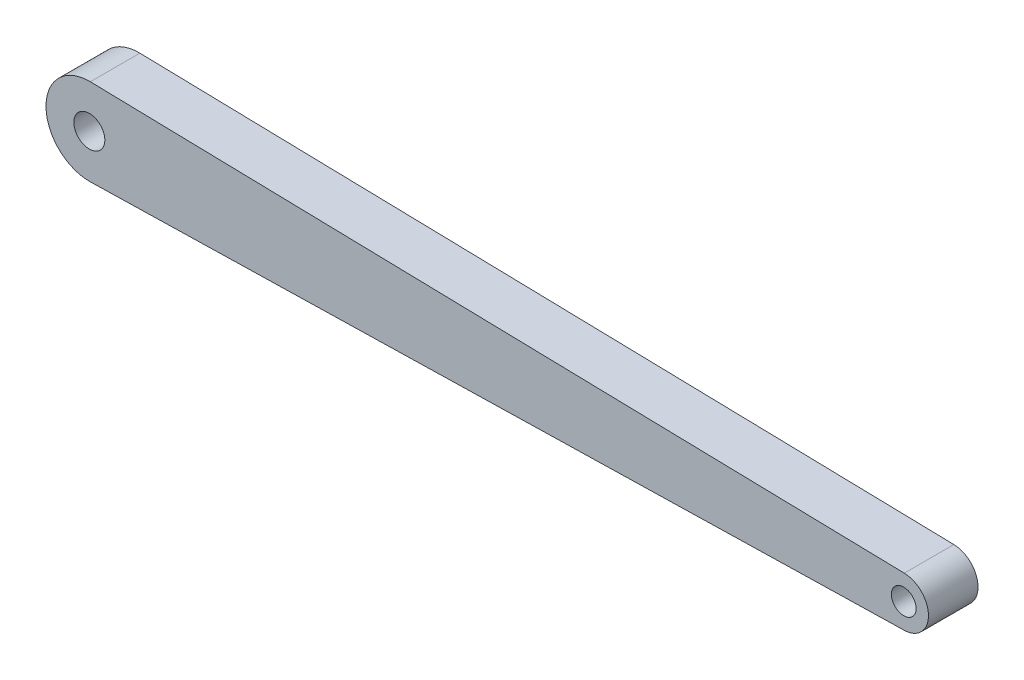
ISO-10303-21;
HEADER;
FILE_DESCRIPTION(('STEP AP214'),'2;1');
FILE_NAME('part.step','',(''),(''),'','','');
FILE_SCHEMA(('AUTOMOTIVE_DESIGN { 1 0 10303 214 1 1 1 1 }'));
ENDSEC;
DATA;
#1=APPLICATION_CONTEXT('core data for automotive mechanical design processes');
#2=APPLICATION_PROTOCOL_DEFINITION('international standard','automotive_design',2000,#1);
#3=PRODUCT_CONTEXT('',#1,'mechanical');
#4=PRODUCT('Part','Part','',(#3));
#5=PRODUCT_RELATED_PRODUCT_CATEGORY('part','',(#4));
#6=PRODUCT_DEFINITION_FORMATION('','',#4);
#7=PRODUCT_DEFINITION_CONTEXT('part definition',#1,'design');
#8=PRODUCT_DEFINITION('design','',#6,#7);
#9=PRODUCT_DEFINITION_SHAPE('','',#8);
#10=(LENGTH_UNIT() NAMED_UNIT(*) SI_UNIT(.MILLI.,.METRE.));
#11=(NAMED_UNIT(*) PLANE_ANGLE_UNIT() SI_UNIT($,.RADIAN.));
#12=(NAMED_UNIT(*) SI_UNIT($,.STERADIAN.) SOLID_ANGLE_UNIT());
#13=UNCERTAINTY_MEASURE_WITH_UNIT(LENGTH_MEASURE(1.E-05),#10,'distance_accuracy_value','');
#14=(GEOMETRIC_REPRESENTATION_CONTEXT(3) GLOBAL_UNCERTAINTY_ASSIGNED_CONTEXT((#13)) GLOBAL_UNIT_ASSIGNED_CONTEXT((#10,
#11,#12)) REPRESENTATION_CONTEXT('',''));
#15=CARTESIAN_POINT('',(0.,0.,0.));
#16=DIRECTION('',(0.,0.,1.));
#17=DIRECTION('',(1.,0.,0.));
#18=AXIS2_PLACEMENT_3D('',#15,#16,#17);
#19=CARTESIAN_POINT('',(-1315.,0.,40.));
#20=DIRECTION('',(0.,0.,-1.));
#21=DIRECTION('',(-1.,0.,0.));
#22=AXIS2_PLACEMENT_3D('',#19,#20,#21);
#23=PLANE('',#22);
#24=CARTESIAN_POINT('',(-1315.,0.,40.));
#25=DIRECTION('',(0.,0.,1.));
#26=DIRECTION('',(-1.,0.,0.));
#27=AXIS2_PLACEMENT_3D('',#24,#25,#26);
#28=CIRCLE('',#27,70.);
#29=CARTESIAN_POINT('',(-1313.40304182509,69.9817813762097,40.));
#30=VERTEX_POINT('',#29);
#31=CARTESIAN_POINT('',(-1313.40304182509,-69.9817813762097,40.));
#32=VERTEX_POINT('',#31);
#33=EDGE_CURVE('E85',#30,#32,#28,.T.);
#34=ORIENTED_EDGE('',*,*,#33,.T.);
#35=DIRECTION('',(0.999739733945852,0.0228136882129278,0.));
#36=VECTOR('',#35,1.);
#37=CARTESIAN_POINT('',(0.912547528517113,-39.9895893578341,40.));
#38=LINE('',#37,#36);
#39=CARTESIAN_POINT('',(0.912547528517113,-39.9895893578341,40.));
#40=VERTEX_POINT('',#39);
#41=EDGE_CURVE('E80',#32,#40,#38,.T.);
#42=ORIENTED_EDGE('',*,*,#41,.T.);
#43=CARTESIAN_POINT('',(0.,0.,40.));
#44=DIRECTION('',(0.,0.,1.));
#45=DIRECTION('',(1.,0.,0.));
#46=AXIS2_PLACEMENT_3D('',#43,#44,#45);
#47=CIRCLE('',#46,40.);
#48=CARTESIAN_POINT('',(0.912547528517098,39.9895893578341,40.));
#49=VERTEX_POINT('',#48);
#50=EDGE_CURVE('E83',#40,#49,#47,.T.);
#51=ORIENTED_EDGE('',*,*,#50,.T.);
#52=DIRECTION('',(-0.999739733945852,0.0228136882129278,0.));
#53=VECTOR('',#52,1.);
#54=CARTESIAN_POINT('',(-1313.40304182509,69.9817813762097,40.));
#55=LINE('',#54,#53);
#56=EDGE_CURVE('E50',#49,#30,#55,.T.);
#57=ORIENTED_EDGE('',*,*,#56,.T.);
#58=EDGE_LOOP('',(#34,#42,#51,#57));
#59=FACE_BOUND('',#58,.T.);
#60=CARTESIAN_POINT('',(0.,0.,40.));
#61=DIRECTION('',(0.,0.,1.));
#62=DIRECTION('',(1.,0.,0.));
#63=AXIS2_PLACEMENT_3D('',#60,#61,#62);
#64=CIRCLE('',#63,20.);
#65=CARTESIAN_POINT('',(20.,0.,40.));
#66=VERTEX_POINT('',#65);
#67=EDGE_CURVE('E100',#66,#66,#64,.T.);
#68=ORIENTED_EDGE('',*,*,#67,.F.);
#69=EDGE_LOOP('',(#68));
#70=FACE_BOUND('',#69,.T.);
#71=CARTESIAN_POINT('',(-1315.,0.,40.));
#72=DIRECTION('',(0.,0.,1.));
#73=DIRECTION('',(1.,0.,0.));
#74=AXIS2_PLACEMENT_3D('',#71,#72,#73);
#75=CIRCLE('',#74,25.);
#76=CARTESIAN_POINT('',(-1290.,0.,40.));
#77=VERTEX_POINT('',#76);
#78=EDGE_CURVE('E115',#77,#77,#75,.T.);
#79=ORIENTED_EDGE('',*,*,#78,.F.);
#80=EDGE_LOOP('',(#79));
#81=FACE_BOUND('',#80,.T.);
#82=ADVANCED_FACE('F33',(#59,#70,#81),#23,.F.);
#83=CARTESIAN_POINT('',(-1315.,0.,-40.));
#84=DIRECTION('',(0.,0.,-1.));
#85=DIRECTION('',(-1.,0.,0.));
#86=AXIS2_PLACEMENT_3D('',#83,#84,#85);
#87=PLANE('',#86);
#88=CARTESIAN_POINT('',(0.,0.,-40.));
#89=DIRECTION('',(0.,0.,1.));
#90=DIRECTION('',(1.,0.,0.));
#91=AXIS2_PLACEMENT_3D('',#88,#89,#90);
#92=CIRCLE('',#91,20.);
#93=CARTESIAN_POINT('',(20.,0.,-40.));
#94=VERTEX_POINT('',#93);
#95=EDGE_CURVE('E112',#94,#94,#92,.T.);
#96=ORIENTED_EDGE('',*,*,#95,.T.);
#97=EDGE_LOOP('',(#96));
#98=FACE_BOUND('',#97,.T.);
#99=CARTESIAN_POINT('',(-1315.,0.,-40.));
#100=DIRECTION('',(0.,0.,1.));
#101=DIRECTION('',(-1.,0.,0.));
#102=AXIS2_PLACEMENT_3D('',#99,#100,#101);
#103=CIRCLE('',#102,70.);
#104=CARTESIAN_POINT('',(-1313.40304182509,69.9817813762097,-40.));
#105=VERTEX_POINT('',#104);
#106=CARTESIAN_POINT('',(-1313.40304182509,-69.9817813762097,-40.));
#107=VERTEX_POINT('',#106);
#108=EDGE_CURVE('E97',#105,#107,#103,.T.);
#109=ORIENTED_EDGE('',*,*,#108,.F.);
#110=DIRECTION('',(-0.999739733945852,0.0228136882129278,0.));
#111=VECTOR('',#110,1.);
#112=CARTESIAN_POINT('',(-1313.40304182509,69.9817813762097,-40.));
#113=LINE('',#112,#111);
#114=CARTESIAN_POINT('',(0.912547528517098,39.9895893578341,-40.));
#115=VERTEX_POINT('',#114);
#116=EDGE_CURVE('E73',#115,#105,#113,.T.);
#117=ORIENTED_EDGE('',*,*,#116,.F.);
#118=CARTESIAN_POINT('',(0.,0.,-40.));
#119=DIRECTION('',(0.,0.,1.));
#120=DIRECTION('',(1.,0.,0.));
#121=AXIS2_PLACEMENT_3D('',#118,#119,#120);
#122=CIRCLE('',#121,40.);
#123=CARTESIAN_POINT('',(0.912547528517113,-39.9895893578341,-40.));
#124=VERTEX_POINT('',#123);
#125=EDGE_CURVE('E67',#124,#115,#122,.T.);
#126=ORIENTED_EDGE('',*,*,#125,.F.);
#127=DIRECTION('',(0.999739733945852,0.0228136882129278,0.));
#128=VECTOR('',#127,1.);
#129=CARTESIAN_POINT('',(0.912547528517113,-39.9895893578341,-40.));
#130=LINE('',#129,#128);
#131=EDGE_CURVE('E89',#107,#124,#130,.T.);
#132=ORIENTED_EDGE('',*,*,#131,.F.);
#133=EDGE_LOOP('',(#109,#117,#126,#132));
#134=FACE_BOUND('',#133,.T.);
#135=CARTESIAN_POINT('',(-1315.,0.,-40.));
#136=DIRECTION('',(0.,0.,1.));
#137=DIRECTION('',(1.,0.,0.));
#138=AXIS2_PLACEMENT_3D('',#135,#136,#137);
#139=CIRCLE('',#138,25.);
#140=CARTESIAN_POINT('',(-1290.,0.,-40.));
#141=VERTEX_POINT('',#140);
#142=EDGE_CURVE('E118',#141,#141,#139,.T.);
#143=ORIENTED_EDGE('',*,*,#142,.T.);
#144=EDGE_LOOP('',(#143));
#145=FACE_BOUND('',#144,.T.);
#146=ADVANCED_FACE('F108',(#98,#134,#145),#87,.T.);
#147=CARTESIAN_POINT('',(-1315.,0.,40.));
#148=DIRECTION('',(0.,0.,-1.));
#149=DIRECTION('',(-1.,0.,0.));
#150=AXIS2_PLACEMENT_3D('',#147,#148,#149);
#151=CYLINDRICAL_SURFACE('',#150,70.);
#152=ORIENTED_EDGE('',*,*,#108,.T.);
#153=DIRECTION('',(0.,0.,-1.));
#154=VECTOR('',#153,1.);
#155=CARTESIAN_POINT('',(-1313.40304182509,-69.9817813762097,40.));
#156=LINE('',#155,#154);
#157=EDGE_CURVE('E11',#32,#107,#156,.T.);
#158=ORIENTED_EDGE('',*,*,#157,.F.);
#159=ORIENTED_EDGE('',*,*,#33,.F.);
#160=DIRECTION('',(0.,0.,-1.));
#161=VECTOR('',#160,1.);
#162=CARTESIAN_POINT('',(-1313.40304182509,69.9817813762097,40.));
#163=LINE('',#162,#161);
#164=EDGE_CURVE('E93',#30,#105,#163,.T.);
#165=ORIENTED_EDGE('',*,*,#164,.T.);
#166=EDGE_LOOP('',(#152,#158,#159,#165));
#167=FACE_BOUND('',#166,.T.);
#168=ADVANCED_FACE('F35',(#167),#151,.T.);
#169=CARTESIAN_POINT('',(0.912547528517113,-39.9895893578341,40.));
#170=DIRECTION('',(-0.0228136882129278,0.999739733945852,0.));
#171=DIRECTION('',(-0.999739733945852,-0.0228136882129278,0.));
#172=AXIS2_PLACEMENT_3D('',#169,#170,#171);
#173=PLANE('',#172);
#174=ORIENTED_EDGE('',*,*,#131,.T.);
#175=DIRECTION('',(0.,0.,-1.));
#176=VECTOR('',#175,1.);
#177=CARTESIAN_POINT('',(0.912547528517113,-39.9895893578341,40.));
#178=LINE('',#177,#176);
#179=EDGE_CURVE('E42',#40,#124,#178,.T.);
#180=ORIENTED_EDGE('',*,*,#179,.F.);
#181=ORIENTED_EDGE('',*,*,#41,.F.);
#182=ORIENTED_EDGE('',*,*,#157,.T.);
#183=EDGE_LOOP('',(#174,#180,#181,#182));
#184=FACE_BOUND('',#183,.T.);
#185=ADVANCED_FACE('F88',(#184),#173,.F.);
#186=CARTESIAN_POINT('',(0.,0.,40.));
#187=DIRECTION('',(0.,0.,-1.));
#188=DIRECTION('',(-1.,0.,0.));
#189=AXIS2_PLACEMENT_3D('',#186,#187,#188);
#190=CYLINDRICAL_SURFACE('',#189,40.);
#191=ORIENTED_EDGE('',*,*,#125,.T.);
#192=DIRECTION('',(0.,0.,-1.));
#193=VECTOR('',#192,1.);
#194=CARTESIAN_POINT('',(0.912547528517098,39.9895893578341,40.));
#195=LINE('',#194,#193);
#196=EDGE_CURVE('E90',#49,#115,#195,.T.);
#197=ORIENTED_EDGE('',*,*,#196,.F.);
#198=ORIENTED_EDGE('',*,*,#50,.F.);
#199=ORIENTED_EDGE('',*,*,#179,.T.);
#200=EDGE_LOOP('',(#191,#197,#198,#199));
#201=FACE_BOUND('',#200,.T.);
#202=ADVANCED_FACE('F91',(#201),#190,.T.);
#203=CARTESIAN_POINT('',(-1313.40304182509,69.9817813762097,40.));
#204=DIRECTION('',(-0.0228136882129278,-0.999739733945852,0.));
#205=DIRECTION('',(0.999739733945852,-0.0228136882129278,0.));
#206=AXIS2_PLACEMENT_3D('',#203,#204,#205);
#207=PLANE('',#206);
#208=ORIENTED_EDGE('',*,*,#116,.T.);
#209=ORIENTED_EDGE('',*,*,#164,.F.);
#210=ORIENTED_EDGE('',*,*,#56,.F.);
#211=ORIENTED_EDGE('',*,*,#196,.T.);
#212=EDGE_LOOP('',(#208,#209,#210,#211));
#213=FACE_BOUND('',#212,.T.);
#214=ADVANCED_FACE('F105',(#213),#207,.F.);
#215=CARTESIAN_POINT('',(0.,0.,40.));
#216=DIRECTION('',(0.,0.,-1.));
#217=DIRECTION('',(-1.,0.,0.));
#218=AXIS2_PLACEMENT_3D('',#215,#216,#217);
#219=CYLINDRICAL_SURFACE('',#218,20.);
#220=ORIENTED_EDGE('',*,*,#67,.T.);
#221=EDGE_LOOP('',(#220));
#222=FACE_BOUND('',#221,.T.);
#223=ORIENTED_EDGE('',*,*,#95,.F.);
#224=EDGE_LOOP('',(#223));
#225=FACE_BOUND('',#224,.T.);
#226=ADVANCED_FACE('F135',(#222,#225),#219,.F.);
#227=CARTESIAN_POINT('',(-1315.,0.,40.));
#228=DIRECTION('',(0.,0.,-1.));
#229=DIRECTION('',(-1.,0.,0.));
#230=AXIS2_PLACEMENT_3D('',#227,#228,#229);
#231=CYLINDRICAL_SURFACE('',#230,25.);
#232=ORIENTED_EDGE('',*,*,#78,.T.);
#233=EDGE_LOOP('',(#232));
#234=FACE_BOUND('',#233,.T.);
#235=ORIENTED_EDGE('',*,*,#142,.F.);
#236=EDGE_LOOP('',(#235));
#237=FACE_BOUND('',#236,.T.);
#238=ADVANCED_FACE('F124',(#234,#237),#231,.F.);
#239=CLOSED_SHELL('',(#82,#146,#168,#185,#202,#214,#226,#238));
#240=MANIFOLD_SOLID_BREP('B2',#239);
#241=ADVANCED_BREP_SHAPE_REPRESENTATION('',(#18,#240),#14);
#242=SHAPE_DEFINITION_REPRESENTATION(#9,#241);
ENDSEC;
END-ISO-10303-21;
